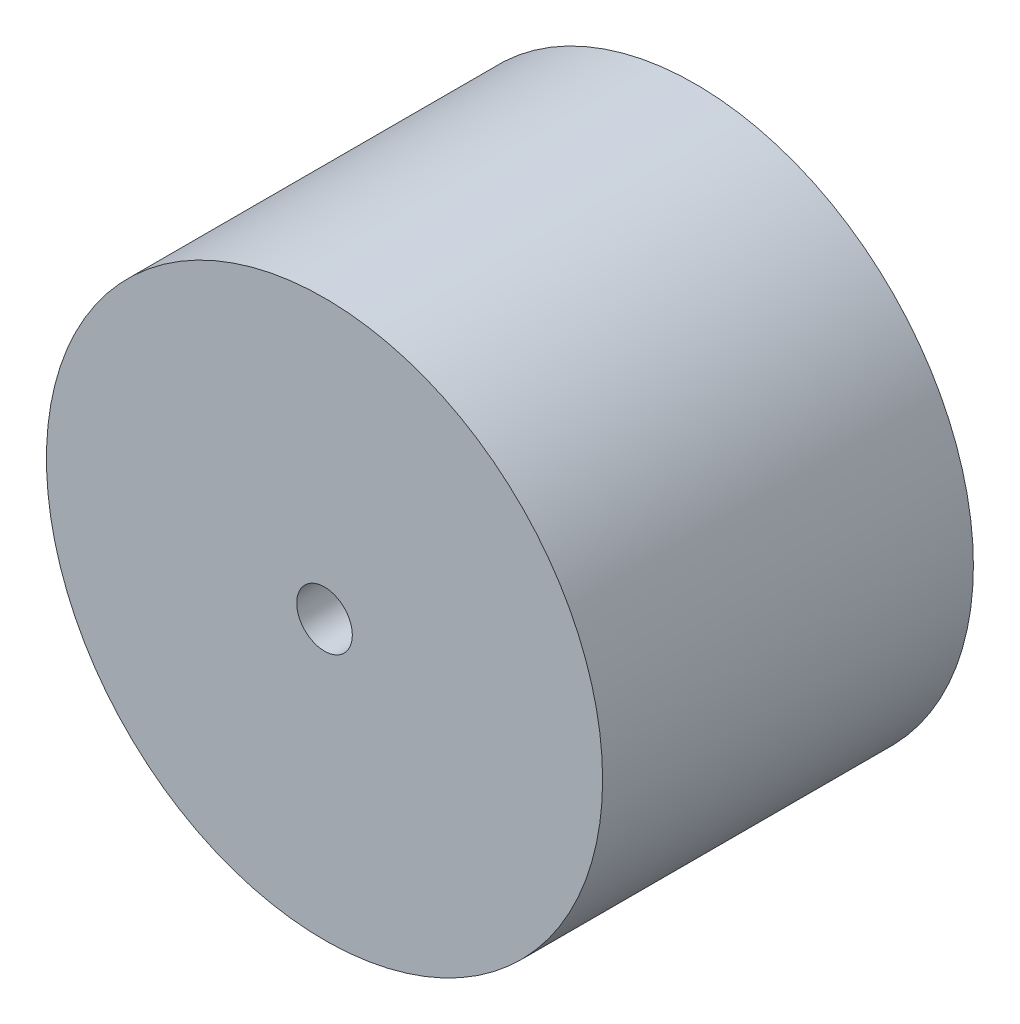
ISO-10303-21;
HEADER;
FILE_DESCRIPTION(('STEP AP214'),'2;1');
FILE_NAME('part.step','',(''),(''),'','','');
FILE_SCHEMA(('AUTOMOTIVE_DESIGN { 1 0 10303 214 1 1 1 1 }'));
ENDSEC;
DATA;
#1=APPLICATION_CONTEXT('core data for automotive mechanical design processes');
#2=APPLICATION_PROTOCOL_DEFINITION('international standard','automotive_design',2000,#1);
#3=PRODUCT_CONTEXT('',#1,'mechanical');
#4=PRODUCT('Part','Part','',(#3));
#5=PRODUCT_RELATED_PRODUCT_CATEGORY('part','',(#4));
#6=PRODUCT_DEFINITION_FORMATION('','',#4);
#7=PRODUCT_DEFINITION_CONTEXT('part definition',#1,'design');
#8=PRODUCT_DEFINITION('design','',#6,#7);
#9=PRODUCT_DEFINITION_SHAPE('','',#8);
#10=(LENGTH_UNIT() NAMED_UNIT(*) SI_UNIT(.MILLI.,.METRE.));
#11=(NAMED_UNIT(*) PLANE_ANGLE_UNIT() SI_UNIT($,.RADIAN.));
#12=(NAMED_UNIT(*) SI_UNIT($,.STERADIAN.) SOLID_ANGLE_UNIT());
#13=UNCERTAINTY_MEASURE_WITH_UNIT(LENGTH_MEASURE(1.E-05),#10,'distance_accuracy_value','');
#14=(GEOMETRIC_REPRESENTATION_CONTEXT(3) GLOBAL_UNCERTAINTY_ASSIGNED_CONTEXT((#13)) GLOBAL_UNIT_ASSIGNED_CONTEXT((#10,
#11,#12)) REPRESENTATION_CONTEXT('',''));
#15=CARTESIAN_POINT('',(0.,0.,0.));
#16=DIRECTION('',(0.,0.,1.));
#17=DIRECTION('',(1.,0.,0.));
#18=AXIS2_PLACEMENT_3D('',#15,#16,#17);
#19=CARTESIAN_POINT('',(0.,0.,20.));
#20=DIRECTION('',(0.,0.,-1.));
#21=DIRECTION('',(-1.,0.,0.));
#22=AXIS2_PLACEMENT_3D('',#19,#20,#21);
#23=CYLINDRICAL_SURFACE('',#22,15.);
#24=CARTESIAN_POINT('',(0.,0.,20.));
#25=DIRECTION('',(0.,0.,1.));
#26=DIRECTION('',(1.,0.,0.));
#27=AXIS2_PLACEMENT_3D('',#24,#25,#26);
#28=CIRCLE('',#27,15.);
#29=CARTESIAN_POINT('',(15.,0.,20.));
#30=VERTEX_POINT('',#29);
#31=EDGE_CURVE('E10',#30,#30,#28,.T.);
#32=ORIENTED_EDGE('',*,*,#31,.F.);
#33=EDGE_LOOP('',(#32));
#34=FACE_BOUND('',#33,.T.);
#35=CARTESIAN_POINT('',(0.,0.,0.));
#36=DIRECTION('',(0.,0.,1.));
#37=DIRECTION('',(1.,0.,0.));
#38=AXIS2_PLACEMENT_3D('',#35,#36,#37);
#39=CIRCLE('',#38,15.);
#40=CARTESIAN_POINT('',(15.,0.,0.));
#41=VERTEX_POINT('',#40);
#42=EDGE_CURVE('E42',#41,#41,#39,.T.);
#43=ORIENTED_EDGE('',*,*,#42,.T.);
#44=EDGE_LOOP('',(#43));
#45=FACE_BOUND('',#44,.T.);
#46=ADVANCED_FACE('F39',(#34,#45),#23,.T.);
#47=CARTESIAN_POINT('',(0.,0.,20.));
#48=DIRECTION('',(0.,0.,1.));
#49=DIRECTION('',(1.,0.,0.));
#50=AXIS2_PLACEMENT_3D('',#47,#48,#49);
#51=PLANE('',#50);
#52=CARTESIAN_POINT('',(0.,0.,20.));
#53=DIRECTION('',(0.,0.,1.));
#54=DIRECTION('',(1.,0.,0.));
#55=AXIS2_PLACEMENT_3D('',#52,#53,#54);
#56=CIRCLE('',#55,1.5);
#57=CARTESIAN_POINT('',(1.5,0.,20.));
#58=VERTEX_POINT('',#57);
#59=EDGE_CURVE('E57',#58,#58,#56,.T.);
#60=ORIENTED_EDGE('',*,*,#59,.F.);
#61=EDGE_LOOP('',(#60));
#62=FACE_BOUND('',#61,.T.);
#63=ORIENTED_EDGE('',*,*,#31,.T.);
#64=EDGE_LOOP('',(#63));
#65=FACE_BOUND('',#64,.T.);
#66=ADVANCED_FACE('F71',(#62,#65),#51,.T.);
#67=CARTESIAN_POINT('',(0.,0.,0.));
#68=DIRECTION('',(0.,0.,1.));
#69=DIRECTION('',(1.,0.,0.));
#70=AXIS2_PLACEMENT_3D('',#67,#68,#69);
#71=PLANE('',#70);
#72=CARTESIAN_POINT('',(0.,0.,0.));
#73=DIRECTION('',(0.,0.,-1.));
#74=DIRECTION('',(-1.,0.,0.));
#75=AXIS2_PLACEMENT_3D('',#72,#73,#74);
#76=CIRCLE('',#75,8.);
#77=CARTESIAN_POINT('',(-8.,0.,0.));
#78=VERTEX_POINT('',#77);
#79=EDGE_CURVE('E53',#78,#78,#76,.T.);
#80=ORIENTED_EDGE('',*,*,#79,.F.);
#81=EDGE_LOOP('',(#80));
#82=FACE_BOUND('',#81,.T.);
#83=ORIENTED_EDGE('',*,*,#42,.F.);
#84=EDGE_LOOP('',(#83));
#85=FACE_BOUND('',#84,.T.);
#86=ADVANCED_FACE('F73',(#82,#85),#71,.F.);
#87=CARTESIAN_POINT('',(0.,0.,13.));
#88=DIRECTION('',(0.,0.,-1.));
#89=DIRECTION('',(-1.,0.,0.));
#90=AXIS2_PLACEMENT_3D('',#87,#88,#89);
#91=CYLINDRICAL_SURFACE('',#90,8.);
#92=CARTESIAN_POINT('',(0.,0.,13.));
#93=DIRECTION('',(0.,0.,-1.));
#94=DIRECTION('',(-1.,0.,0.));
#95=AXIS2_PLACEMENT_3D('',#92,#93,#94);
#96=CIRCLE('',#95,8.);
#97=CARTESIAN_POINT('',(-8.,0.,13.));
#98=VERTEX_POINT('',#97);
#99=EDGE_CURVE('E51',#98,#98,#96,.T.);
#100=CARTESIAN_POINT('',(-8.,0.,13.));
#101=CARTESIAN_POINT('',(-8.,0.,12.8645833333333));
#102=CARTESIAN_POINT('',(-8.,0.,12.7291666666667));
#103=CARTESIAN_POINT('',(-8.,0.,12.4583333333333));
#104=CARTESIAN_POINT('',(-8.,0.,12.3229166666667));
#105=CARTESIAN_POINT('',(-8.,0.,12.0520833333333));
#106=CARTESIAN_POINT('',(-8.,0.,11.9166666666667));
#107=CARTESIAN_POINT('',(-8.,0.,11.6458333333333));
#108=CARTESIAN_POINT('',(-8.,0.,11.5104166666667));
#109=CARTESIAN_POINT('',(-8.,0.,11.2395833333333));
#110=CARTESIAN_POINT('',(-8.,0.,11.1041666666667));
#111=CARTESIAN_POINT('',(-8.,0.,10.8333333333333));
#112=CARTESIAN_POINT('',(-8.,0.,10.6979166666667));
#113=CARTESIAN_POINT('',(-8.,0.,10.4270833333333));
#114=CARTESIAN_POINT('',(-8.,0.,10.2916666666667));
#115=CARTESIAN_POINT('',(-8.,0.,10.0208333333333));
#116=CARTESIAN_POINT('',(-8.,0.,9.88541666666667));
#117=CARTESIAN_POINT('',(-8.,0.,9.61458333333333));
#118=CARTESIAN_POINT('',(-8.,0.,9.47916666666667));
#119=CARTESIAN_POINT('',(-8.,0.,9.20833333333333));
#120=CARTESIAN_POINT('',(-8.,0.,9.07291666666667));
#121=CARTESIAN_POINT('',(-8.,0.,8.80208333333333));
#122=CARTESIAN_POINT('',(-8.,0.,8.66666666666667));
#123=CARTESIAN_POINT('',(-8.,0.,8.39583333333333));
#124=CARTESIAN_POINT('',(-8.,0.,8.26041666666667));
#125=CARTESIAN_POINT('',(-8.,0.,7.98958333333333));
#126=CARTESIAN_POINT('',(-8.,0.,7.85416666666667));
#127=CARTESIAN_POINT('',(-8.,0.,7.58333333333333));
#128=CARTESIAN_POINT('',(-8.,0.,7.44791666666667));
#129=CARTESIAN_POINT('',(-8.,0.,7.17708333333333));
#130=CARTESIAN_POINT('',(-8.,0.,7.04166666666667));
#131=CARTESIAN_POINT('',(-8.,0.,6.77083333333333));
#132=CARTESIAN_POINT('',(-8.,0.,6.63541666666667));
#133=CARTESIAN_POINT('',(-8.,0.,6.36458333333333));
#134=CARTESIAN_POINT('',(-8.,0.,6.22916666666667));
#135=CARTESIAN_POINT('',(-8.,0.,5.95833333333333));
#136=CARTESIAN_POINT('',(-8.,0.,5.82291666666667));
#137=CARTESIAN_POINT('',(-8.,0.,5.55208333333333));
#138=CARTESIAN_POINT('',(-8.,0.,5.41666666666667));
#139=CARTESIAN_POINT('',(-8.,0.,5.14583333333333));
#140=CARTESIAN_POINT('',(-8.,0.,5.01041666666667));
#141=CARTESIAN_POINT('',(-8.,0.,4.73958333333333));
#142=CARTESIAN_POINT('',(-8.,0.,4.60416666666667));
#143=CARTESIAN_POINT('',(-8.,0.,4.33333333333333));
#144=CARTESIAN_POINT('',(-8.,0.,4.19791666666667));
#145=CARTESIAN_POINT('',(-8.,0.,3.92708333333333));
#146=CARTESIAN_POINT('',(-8.,0.,3.79166666666667));
#147=CARTESIAN_POINT('',(-8.,0.,3.52083333333333));
#148=CARTESIAN_POINT('',(-8.,0.,3.38541666666667));
#149=CARTESIAN_POINT('',(-8.,0.,3.11458333333333));
#150=CARTESIAN_POINT('',(-8.,0.,2.97916666666667));
#151=CARTESIAN_POINT('',(-8.,0.,2.70833333333333));
#152=CARTESIAN_POINT('',(-8.,0.,2.57291666666667));
#153=CARTESIAN_POINT('',(-8.,0.,2.30208333333333));
#154=CARTESIAN_POINT('',(-8.,0.,2.16666666666667));
#155=CARTESIAN_POINT('',(-8.,0.,1.89583333333333));
#156=CARTESIAN_POINT('',(-8.,0.,1.76041666666667));
#157=CARTESIAN_POINT('',(-8.,0.,1.48958333333333));
#158=CARTESIAN_POINT('',(-8.,0.,1.35416666666667));
#159=CARTESIAN_POINT('',(-8.,0.,1.08333333333333));
#160=CARTESIAN_POINT('',(-8.,0.,0.947916666666667));
#161=CARTESIAN_POINT('',(-8.,0.,0.677083333333334));
#162=CARTESIAN_POINT('',(-8.,0.,0.541666666666667));
#163=CARTESIAN_POINT('',(-8.,0.,0.270833333333334));
#164=CARTESIAN_POINT('',(-8.,0.,0.135416666666667));
#165=CARTESIAN_POINT('',(-8.,0.,0.));
#166=B_SPLINE_CURVE_WITH_KNOTS('',3,(#100,#101,#102,#103,#104,#105,#106,#107,#108,#109,#110,
#111,#112,#113,#114,#115,#116,#117,#118,#119,#120,#121,#122,#123,#124,#125,#126,#127,#128,#129,
#130,#131,#132,#133,#134,#135,#136,#137,#138,#139,#140,#141,#142,#143,#144,#145,#146,#147,#148,
#149,#150,#151,#152,#153,#154,#155,#156,#157,#158,#159,#160,#161,#162,#163,#164,#165),
.UNSPECIFIED.,.F.,.F.,(4,2,2,2,2,2,2,2,2,2,2,2,2,2,2,2,2,2,2,2,2,2,2,2,2,2,2,2,2,2,2,2,4),(0.,
0.406249999999999,0.812499999999999,1.21875,1.625,2.03125,2.4375,2.84375,3.25,3.65625,4.0625,
4.46875,4.875,5.28125,5.6875,6.09375,6.5,6.90625,7.3125,7.71875,8.125,8.53125,8.9375,9.34375,
9.75,10.15625,10.5625,10.96875,11.375,11.78125,12.1875,12.59375,13.),.UNSPECIFIED.);
#167=EDGE_CURVE('BSEAM79',#98,#78,#166,.T.);
#168=ORIENTED_EDGE('',*,*,#99,.F.);
#169=ORIENTED_EDGE('',*,*,#79,.T.);
#170=ORIENTED_EDGE('',*,*,#167,.T.);
#171=ORIENTED_EDGE('',*,*,#167,.F.);
#172=EDGE_LOOP('',(#168,#170,#169,#171));
#173=FACE_BOUND('',#172,.T.);
#174=ADVANCED_FACE('F79',(#173),#91,.F.);
#175=CARTESIAN_POINT('',(0.,0.,13.));
#176=DIRECTION('',(0.,0.,-1.));
#177=DIRECTION('',(-1.,0.,0.));
#178=AXIS2_PLACEMENT_3D('',#175,#176,#177);
#179=PLANE('',#178);
#180=CARTESIAN_POINT('',(0.,0.,13.));
#181=DIRECTION('',(0.,0.,-1.));
#182=DIRECTION('',(-1.,0.,0.));
#183=AXIS2_PLACEMENT_3D('',#180,#181,#182);
#184=CIRCLE('',#183,1.5);
#185=CARTESIAN_POINT('',(-1.5,0.,13.));
#186=VERTEX_POINT('',#185);
#187=EDGE_CURVE('E61',#186,#186,#184,.F.);
#188=ORIENTED_EDGE('',*,*,#187,.T.);
#189=EDGE_LOOP('',(#188));
#190=FACE_BOUND('',#189,.T.);
#191=ORIENTED_EDGE('',*,*,#99,.T.);
#192=EDGE_LOOP('',(#191));
#193=FACE_BOUND('',#192,.T.);
#194=ADVANCED_FACE('F85',(#190,#193),#179,.T.);
#195=CARTESIAN_POINT('',(0.,0.,-0.001000000000001));
#196=DIRECTION('',(0.,0.,1.));
#197=DIRECTION('',(1.,0.,0.));
#198=AXIS2_PLACEMENT_3D('',#195,#196,#197);
#199=CYLINDRICAL_SURFACE('',#198,1.5);
#200=ORIENTED_EDGE('',*,*,#187,.F.);
#201=EDGE_LOOP('',(#200));
#202=FACE_BOUND('',#201,.T.);
#203=ORIENTED_EDGE('',*,*,#59,.T.);
#204=EDGE_LOOP('',(#203));
#205=FACE_BOUND('',#204,.T.);
#206=ADVANCED_FACE('F69',(#202,#205),#199,.F.);
#207=CLOSED_SHELL('',(#46,#66,#86,#174,#194,#206));
#208=MANIFOLD_SOLID_BREP('B2',#207);
#209=ADVANCED_BREP_SHAPE_REPRESENTATION('',(#18,#208),#14);
#210=SHAPE_DEFINITION_REPRESENTATION(#9,#209);
ENDSEC;
END-ISO-10303-21;
